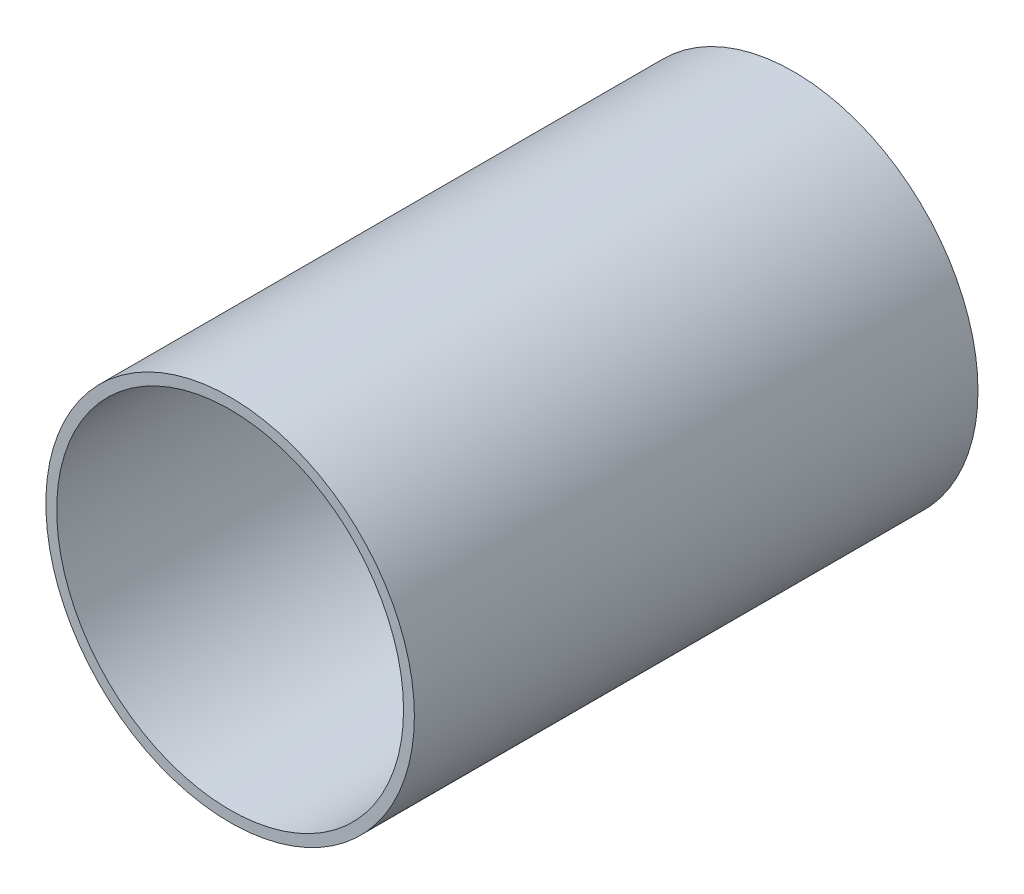
ISO-10303-21;
HEADER;
FILE_DESCRIPTION(('STEP AP214'),'2;1');
FILE_NAME('part.step','',(''),(''),'','','');
FILE_SCHEMA(('AUTOMOTIVE_DESIGN { 1 0 10303 214 1 1 1 1 }'));
ENDSEC;
DATA;
#1=APPLICATION_CONTEXT('core data for automotive mechanical design processes');
#2=APPLICATION_PROTOCOL_DEFINITION('international standard','automotive_design',2000,#1);
#3=PRODUCT_CONTEXT('',#1,'mechanical');
#4=PRODUCT('Part','Part','',(#3));
#5=PRODUCT_RELATED_PRODUCT_CATEGORY('part','',(#4));
#6=PRODUCT_DEFINITION_FORMATION('','',#4);
#7=PRODUCT_DEFINITION_CONTEXT('part definition',#1,'design');
#8=PRODUCT_DEFINITION('design','',#6,#7);
#9=PRODUCT_DEFINITION_SHAPE('','',#8);
#10=(LENGTH_UNIT() NAMED_UNIT(*) SI_UNIT(.MILLI.,.METRE.));
#11=(NAMED_UNIT(*) PLANE_ANGLE_UNIT() SI_UNIT($,.RADIAN.));
#12=(NAMED_UNIT(*) SI_UNIT($,.STERADIAN.) SOLID_ANGLE_UNIT());
#13=UNCERTAINTY_MEASURE_WITH_UNIT(LENGTH_MEASURE(1.E-05),#10,'distance_accuracy_value','');
#14=(GEOMETRIC_REPRESENTATION_CONTEXT(3) GLOBAL_UNCERTAINTY_ASSIGNED_CONTEXT((#13)) GLOBAL_UNIT_ASSIGNED_CONTEXT((#10,
#11,#12)) REPRESENTATION_CONTEXT('',''));
#15=CARTESIAN_POINT('',(0.,0.,0.));
#16=DIRECTION('',(0.,0.,1.));
#17=DIRECTION('',(1.,0.,0.));
#18=AXIS2_PLACEMENT_3D('',#15,#16,#17);
#19=CARTESIAN_POINT('',(0.,0.,1.));
#20=DIRECTION('',(0.,0.,-1.));
#21=DIRECTION('',(-1.,0.,0.));
#22=AXIS2_PLACEMENT_3D('',#19,#20,#21);
#23=CYLINDRICAL_SURFACE('',#22,8.5);
#24=CARTESIAN_POINT('',(0.,0.,0.));
#25=DIRECTION('',(0.,0.,1.));
#26=DIRECTION('',(1.,0.,0.));
#27=AXIS2_PLACEMENT_3D('',#24,#25,#26);
#28=CIRCLE('',#27,8.5);
#29=CARTESIAN_POINT('',(8.5,0.,0.));
#30=VERTEX_POINT('',#29);
#31=EDGE_CURVE('E59',#30,#30,#28,.T.);
#32=ORIENTED_EDGE('',*,*,#31,.T.);
#33=EDGE_LOOP('',(#32));
#34=FACE_BOUND('',#33,.T.);
#35=CARTESIAN_POINT('',(0.,0.,26.));
#36=DIRECTION('',(0.,0.,1.));
#37=DIRECTION('',(1.,0.,0.));
#38=AXIS2_PLACEMENT_3D('',#35,#36,#37);
#39=CIRCLE('',#38,8.5);
#40=CARTESIAN_POINT('',(8.5,0.,26.));
#41=VERTEX_POINT('',#40);
#42=EDGE_CURVE('E64',#41,#41,#39,.T.);
#43=ORIENTED_EDGE('',*,*,#42,.F.);
#44=EDGE_LOOP('',(#43));
#45=FACE_BOUND('',#44,.T.);
#46=ADVANCED_FACE('F45',(#34,#45),#23,.T.);
#47=CARTESIAN_POINT('',(0.,0.,0.));
#48=DIRECTION('',(0.,0.,1.));
#49=DIRECTION('',(1.,0.,0.));
#50=AXIS2_PLACEMENT_3D('',#47,#48,#49);
#51=PLANE('',#50);
#52=ORIENTED_EDGE('',*,*,#31,.F.);
#53=EDGE_LOOP('',(#52));
#54=FACE_BOUND('',#53,.T.);
#55=ADVANCED_FACE('F79',(#54),#51,.F.);
#56=CARTESIAN_POINT('',(0.,0.,26.));
#57=DIRECTION('',(0.,0.,1.));
#58=DIRECTION('',(1.,0.,0.));
#59=AXIS2_PLACEMENT_3D('',#56,#57,#58);
#60=PLANE('',#59);
#61=ORIENTED_EDGE('',*,*,#42,.T.);
#62=EDGE_LOOP('',(#61));
#63=FACE_BOUND('',#62,.T.);
#64=CARTESIAN_POINT('',(0.,0.,26.));
#65=DIRECTION('',(0.,0.,1.));
#66=DIRECTION('',(1.,0.,0.));
#67=AXIS2_PLACEMENT_3D('',#64,#65,#66);
#68=CIRCLE('',#67,8.);
#69=CARTESIAN_POINT('',(8.,0.,26.));
#70=VERTEX_POINT('',#69);
#71=EDGE_CURVE('E70',#70,#70,#68,.T.);
#72=ORIENTED_EDGE('',*,*,#71,.F.);
#73=EDGE_LOOP('',(#72));
#74=FACE_BOUND('',#73,.T.);
#75=ADVANCED_FACE('F77',(#63,#74),#60,.T.);
#76=CARTESIAN_POINT('',(0.,0.,26.));
#77=DIRECTION('',(0.,0.,-1.));
#78=DIRECTION('',(-1.,0.,0.));
#79=AXIS2_PLACEMENT_3D('',#76,#77,#78);
#80=CYLINDRICAL_SURFACE('',#79,8.);
#81=CARTESIAN_POINT('',(0.,0.,2.00000000000001));
#82=DIRECTION('',(0.,0.,1.));
#83=DIRECTION('',(1.,0.,0.));
#84=AXIS2_PLACEMENT_3D('',#81,#82,#83);
#85=CIRCLE('',#84,8.);
#86=CARTESIAN_POINT('',(8.,0.,2.00000000000001));
#87=VERTEX_POINT('',#86);
#88=EDGE_CURVE('E54',#87,#87,#85,.F.);
#89=ORIENTED_EDGE('',*,*,#88,.T.);
#90=EDGE_LOOP('',(#89));
#91=FACE_BOUND('',#90,.T.);
#92=ORIENTED_EDGE('',*,*,#71,.T.);
#93=EDGE_LOOP('',(#92));
#94=FACE_BOUND('',#93,.T.);
#95=ADVANCED_FACE('F75',(#91,#94),#80,.F.);
#96=CARTESIAN_POINT('',(0.,0.,1.));
#97=DIRECTION('',(0.,0.,1.));
#98=DIRECTION('',(1.,0.,0.));
#99=AXIS2_PLACEMENT_3D('',#96,#97,#98);
#100=PLANE('',#99);
#101=CARTESIAN_POINT('',(0.,0.,1.));
#102=DIRECTION('',(0.,0.,1.));
#103=DIRECTION('',(1.,0.,0.));
#104=AXIS2_PLACEMENT_3D('',#101,#102,#103);
#105=CIRCLE('',#104,7.00000000000001);
#106=CARTESIAN_POINT('',(7.00000000000001,0.,1.));
#107=VERTEX_POINT('',#106);
#108=EDGE_CURVE('E10',#107,#107,#105,.T.);
#109=ORIENTED_EDGE('',*,*,#108,.T.);
#110=EDGE_LOOP('',(#109));
#111=FACE_BOUND('',#110,.T.);
#112=ADVANCED_FACE('F86',(#111),#100,.T.);
#113=CARTESIAN_POINT('',(0.,0.,2.00000000000001));
#114=DIRECTION('',(0.,0.,1.));
#115=DIRECTION('',(1.,0.,0.));
#116=AXIS2_PLACEMENT_3D('',#113,#114,#115);
#117=CONICAL_SURFACE('',#116,8.,0.785398163397443);
#118=ORIENTED_EDGE('',*,*,#108,.F.);
#119=EDGE_LOOP('',(#118));
#120=FACE_BOUND('',#119,.T.);
#121=ORIENTED_EDGE('',*,*,#88,.F.);
#122=EDGE_LOOP('',(#121));
#123=FACE_BOUND('',#122,.T.);
#124=ADVANCED_FACE('F48',(#120,#123),#117,.F.);
#125=CLOSED_SHELL('',(#46,#55,#75,#95,#112,#124));
#126=MANIFOLD_SOLID_BREP('B2',#125);
#127=ADVANCED_BREP_SHAPE_REPRESENTATION('',(#18,#126),#14);
#128=SHAPE_DEFINITION_REPRESENTATION(#9,#127);
ENDSEC;
END-ISO-10303-21;
